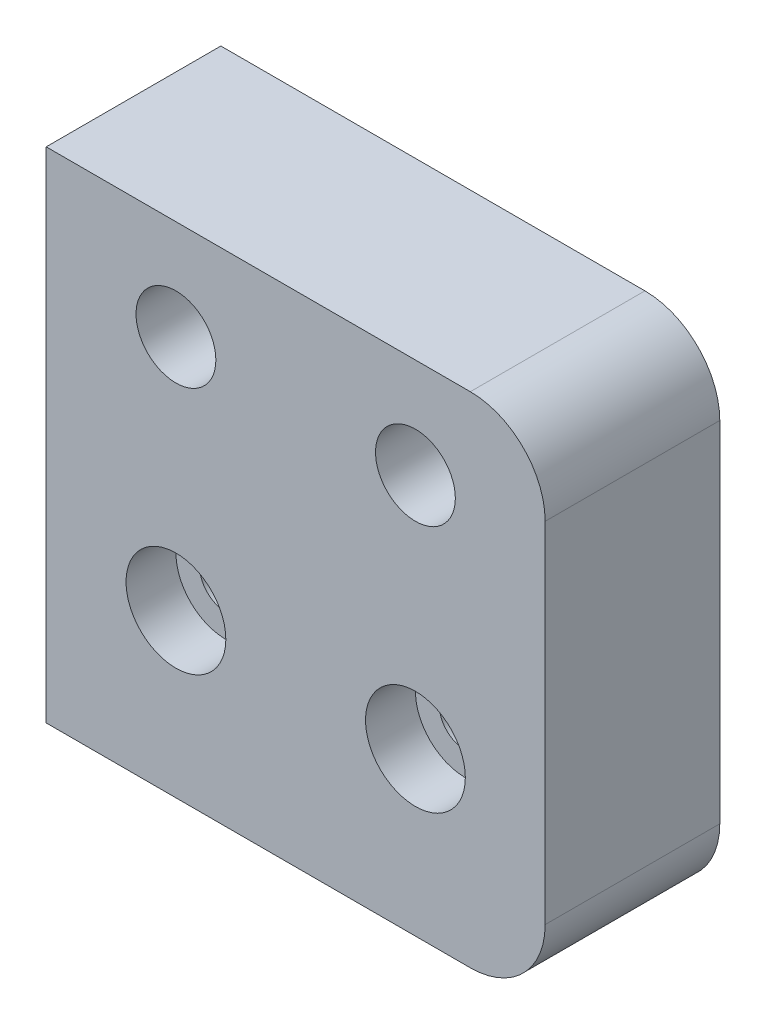
ISO-10303-21;
HEADER;
FILE_DESCRIPTION(('STEP AP214'),'2;1');
FILE_NAME('part.step','',(''),(''),'','','');
FILE_SCHEMA(('AUTOMOTIVE_DESIGN { 1 0 10303 214 1 1 1 1 }'));
ENDSEC;
DATA;
#1=APPLICATION_CONTEXT('core data for automotive mechanical design processes');
#2=APPLICATION_PROTOCOL_DEFINITION('international standard','automotive_design',2000,#1);
#3=PRODUCT_CONTEXT('',#1,'mechanical');
#4=PRODUCT('Part','Part','',(#3));
#5=PRODUCT_RELATED_PRODUCT_CATEGORY('part','',(#4));
#6=PRODUCT_DEFINITION_FORMATION('','',#4);
#7=PRODUCT_DEFINITION_CONTEXT('part definition',#1,'design');
#8=PRODUCT_DEFINITION('design','',#6,#7);
#9=PRODUCT_DEFINITION_SHAPE('','',#8);
#10=(LENGTH_UNIT() NAMED_UNIT(*) SI_UNIT(.MILLI.,.METRE.));
#11=(NAMED_UNIT(*) PLANE_ANGLE_UNIT() SI_UNIT($,.RADIAN.));
#12=(NAMED_UNIT(*) SI_UNIT($,.STERADIAN.) SOLID_ANGLE_UNIT());
#13=UNCERTAINTY_MEASURE_WITH_UNIT(LENGTH_MEASURE(1.E-05),#10,'distance_accuracy_value','');
#14=(GEOMETRIC_REPRESENTATION_CONTEXT(3) GLOBAL_UNCERTAINTY_ASSIGNED_CONTEXT((#13)) GLOBAL_UNIT_ASSIGNED_CONTEXT((#10,
#11,#12)) REPRESENTATION_CONTEXT('',''));
#15=CARTESIAN_POINT('',(0.,0.,0.));
#16=DIRECTION('',(0.,0.,1.));
#17=DIRECTION('',(1.,0.,0.));
#18=AXIS2_PLACEMENT_3D('',#15,#16,#17);
#19=CARTESIAN_POINT('',(14.8,6.5,7.));
#20=DIRECTION('',(0.,0.,-1.));
#21=DIRECTION('',(-1.,0.,0.));
#22=AXIS2_PLACEMENT_3D('',#19,#20,#21);
#23=CYLINDRICAL_SURFACE('',#22,1.05);
#24=CARTESIAN_POINT('',(14.8,6.5,0.));
#25=DIRECTION('',(0.,0.,1.));
#26=DIRECTION('',(1.,0.,0.));
#27=AXIS2_PLACEMENT_3D('',#24,#25,#26);
#28=CIRCLE('',#27,1.05);
#29=CARTESIAN_POINT('',(15.85,6.5,0.));
#30=VERTEX_POINT('',#29);
#31=EDGE_CURVE('E139',#30,#30,#28,.T.);
#32=ORIENTED_EDGE('',*,*,#31,.F.);
#33=EDGE_LOOP('',(#32));
#34=FACE_BOUND('',#33,.T.);
#35=CARTESIAN_POINT('',(14.8,6.5,5.));
#36=DIRECTION('',(0.,0.,1.));
#37=DIRECTION('',(1.,0.,0.));
#38=AXIS2_PLACEMENT_3D('',#35,#36,#37);
#39=CIRCLE('',#38,1.05);
#40=CARTESIAN_POINT('',(15.85,6.5,5.));
#41=VERTEX_POINT('',#40);
#42=EDGE_CURVE('E37',#41,#41,#39,.T.);
#43=ORIENTED_EDGE('',*,*,#42,.T.);
#44=EDGE_LOOP('',(#43));
#45=FACE_BOUND('',#44,.T.);
#46=ADVANCED_FACE('F33',(#34,#45),#23,.F.);
#47=CARTESIAN_POINT('',(5.2,6.5,7.));
#48=DIRECTION('',(0.,0.,-1.));
#49=DIRECTION('',(-1.,0.,0.));
#50=AXIS2_PLACEMENT_3D('',#47,#48,#49);
#51=CYLINDRICAL_SURFACE('',#50,1.05);
#52=CARTESIAN_POINT('',(5.2,6.5,0.));
#53=DIRECTION('',(0.,0.,1.));
#54=DIRECTION('',(1.,0.,0.));
#55=AXIS2_PLACEMENT_3D('',#52,#53,#54);
#56=CIRCLE('',#55,1.05);
#57=CARTESIAN_POINT('',(6.25,6.5,0.));
#58=VERTEX_POINT('',#57);
#59=EDGE_CURVE('E144',#58,#58,#56,.T.);
#60=ORIENTED_EDGE('',*,*,#59,.F.);
#61=EDGE_LOOP('',(#60));
#62=FACE_BOUND('',#61,.T.);
#63=CARTESIAN_POINT('',(5.2,6.5,5.));
#64=DIRECTION('',(0.,0.,1.));
#65=DIRECTION('',(1.,0.,0.));
#66=AXIS2_PLACEMENT_3D('',#63,#64,#65);
#67=CIRCLE('',#66,1.05);
#68=CARTESIAN_POINT('',(6.25,6.5,5.));
#69=VERTEX_POINT('',#68);
#70=EDGE_CURVE('E137',#69,#69,#67,.T.);
#71=ORIENTED_EDGE('',*,*,#70,.T.);
#72=EDGE_LOOP('',(#71));
#73=FACE_BOUND('',#72,.T.);
#74=ADVANCED_FACE('F196',(#62,#73),#51,.F.);
#75=CARTESIAN_POINT('',(17.,17.,7.));
#76=DIRECTION('',(0.,0.,1.));
#77=DIRECTION('',(1.,0.,0.));
#78=AXIS2_PLACEMENT_3D('',#75,#76,#77);
#79=PLANE('',#78);
#80=CARTESIAN_POINT('',(14.8,6.5,7.));
#81=DIRECTION('',(0.,0.,1.));
#82=DIRECTION('',(1.,0.,0.));
#83=AXIS2_PLACEMENT_3D('',#80,#81,#82);
#84=CIRCLE('',#83,2.);
#85=CARTESIAN_POINT('',(16.8,6.5,7.));
#86=VERTEX_POINT('',#85);
#87=EDGE_CURVE('E154',#86,#86,#84,.T.);
#88=ORIENTED_EDGE('',*,*,#87,.F.);
#89=EDGE_LOOP('',(#88));
#90=FACE_BOUND('',#89,.T.);
#91=CARTESIAN_POINT('',(5.2,6.5,7.));
#92=DIRECTION('',(0.,0.,1.));
#93=DIRECTION('',(1.,0.,0.));
#94=AXIS2_PLACEMENT_3D('',#91,#92,#93);
#95=CIRCLE('',#94,2.);
#96=CARTESIAN_POINT('',(7.2,6.5,7.));
#97=VERTEX_POINT('',#96);
#98=EDGE_CURVE('E147',#97,#97,#95,.T.);
#99=ORIENTED_EDGE('',*,*,#98,.F.);
#100=EDGE_LOOP('',(#99));
#101=FACE_BOUND('',#100,.T.);
#102=CARTESIAN_POINT('',(5.2,16.,7.));
#103=DIRECTION('',(0.,0.,1.));
#104=DIRECTION('',(1.,0.,0.));
#105=AXIS2_PLACEMENT_3D('',#102,#103,#104);
#106=CIRCLE('',#105,1.6);
#107=CARTESIAN_POINT('',(6.8,16.,7.));
#108=VERTEX_POINT('',#107);
#109=EDGE_CURVE('E125',#108,#108,#106,.T.);
#110=ORIENTED_EDGE('',*,*,#109,.F.);
#111=EDGE_LOOP('',(#110));
#112=FACE_BOUND('',#111,.T.);
#113=DIRECTION('',(0.,-1.,0.));
#114=VECTOR('',#113,1.);
#115=CARTESIAN_POINT('',(0.,0.,7.));
#116=LINE('',#115,#114);
#117=CARTESIAN_POINT('',(0.,20.,7.));
#118=VERTEX_POINT('',#117);
#119=CARTESIAN_POINT('',(0.,0.,7.));
#120=VERTEX_POINT('',#119);
#121=EDGE_CURVE('E132',#118,#120,#116,.T.);
#122=ORIENTED_EDGE('',*,*,#121,.T.);
#123=DIRECTION('',(1.,0.,0.));
#124=VECTOR('',#123,1.);
#125=CARTESIAN_POINT('',(0.,0.,7.));
#126=LINE('',#125,#124);
#127=CARTESIAN_POINT('',(17.,0.,7.));
#128=VERTEX_POINT('',#127);
#129=EDGE_CURVE('E89',#120,#128,#126,.T.);
#130=ORIENTED_EDGE('',*,*,#129,.T.);
#131=CARTESIAN_POINT('',(17.,3.,7.));
#132=DIRECTION('',(0.,0.,1.));
#133=DIRECTION('',(1.,0.,0.));
#134=AXIS2_PLACEMENT_3D('',#131,#132,#133);
#135=CIRCLE('',#134,3.);
#136=CARTESIAN_POINT('',(20.,3.00000000000002,7.));
#137=VERTEX_POINT('',#136);
#138=EDGE_CURVE('E103',#128,#137,#135,.T.);
#139=ORIENTED_EDGE('',*,*,#138,.T.);
#140=DIRECTION('',(0.,1.,0.));
#141=VECTOR('',#140,1.);
#142=CARTESIAN_POINT('',(20.,3.00000000000002,7.));
#143=LINE('',#142,#141);
#144=CARTESIAN_POINT('',(20.,17.,7.));
#145=VERTEX_POINT('',#144);
#146=EDGE_CURVE('E96',#137,#145,#143,.T.);
#147=ORIENTED_EDGE('',*,*,#146,.T.);
#148=CARTESIAN_POINT('',(17.,17.,7.));
#149=DIRECTION('',(0.,0.,1.));
#150=DIRECTION('',(1.,0.,0.));
#151=AXIS2_PLACEMENT_3D('',#148,#149,#150);
#152=CIRCLE('',#151,3.);
#153=CARTESIAN_POINT('',(17.,20.,7.));
#154=VERTEX_POINT('',#153);
#155=EDGE_CURVE('E101',#145,#154,#152,.T.);
#156=ORIENTED_EDGE('',*,*,#155,.T.);
#157=DIRECTION('',(-1.,0.,0.));
#158=VECTOR('',#157,1.);
#159=CARTESIAN_POINT('',(0.,20.,7.));
#160=LINE('',#159,#158);
#161=EDGE_CURVE('E52',#154,#118,#160,.T.);
#162=ORIENTED_EDGE('',*,*,#161,.T.);
#163=EDGE_LOOP('',(#122,#130,#139,#147,#156,#162));
#164=FACE_BOUND('',#163,.T.);
#165=CARTESIAN_POINT('',(14.8,16.,7.));
#166=DIRECTION('',(0.,0.,1.));
#167=DIRECTION('',(1.,0.,0.));
#168=AXIS2_PLACEMENT_3D('',#165,#166,#167);
#169=CIRCLE('',#168,1.6);
#170=CARTESIAN_POINT('',(16.4,16.,7.));
#171=VERTEX_POINT('',#170);
#172=EDGE_CURVE('E160',#171,#171,#169,.T.);
#173=ORIENTED_EDGE('',*,*,#172,.F.);
#174=EDGE_LOOP('',(#173));
#175=FACE_BOUND('',#174,.T.);
#176=ADVANCED_FACE('F98',(#90,#101,#112,#164,#175),#79,.T.);
#177=CARTESIAN_POINT('',(17.,17.,0.));
#178=DIRECTION('',(0.,0.,1.));
#179=DIRECTION('',(1.,0.,0.));
#180=AXIS2_PLACEMENT_3D('',#177,#178,#179);
#181=PLANE('',#180);
#182=ORIENTED_EDGE('',*,*,#59,.T.);
#183=EDGE_LOOP('',(#182));
#184=FACE_BOUND('',#183,.T.);
#185=CARTESIAN_POINT('',(5.2,16.,0.));
#186=DIRECTION('',(0.,0.,1.));
#187=DIRECTION('',(1.,0.,0.));
#188=AXIS2_PLACEMENT_3D('',#185,#186,#187);
#189=CIRCLE('',#188,1.6);
#190=CARTESIAN_POINT('',(6.8,16.,0.));
#191=VERTEX_POINT('',#190);
#192=EDGE_CURVE('E163',#191,#191,#189,.T.);
#193=ORIENTED_EDGE('',*,*,#192,.T.);
#194=EDGE_LOOP('',(#193));
#195=FACE_BOUND('',#194,.T.);
#196=DIRECTION('',(0.,-1.,0.));
#197=VECTOR('',#196,1.);
#198=CARTESIAN_POINT('',(0.,0.,0.));
#199=LINE('',#198,#197);
#200=CARTESIAN_POINT('',(0.,20.,0.));
#201=VERTEX_POINT('',#200);
#202=CARTESIAN_POINT('',(0.,0.,0.));
#203=VERTEX_POINT('',#202);
#204=EDGE_CURVE('E121',#201,#203,#199,.T.);
#205=ORIENTED_EDGE('',*,*,#204,.F.);
#206=DIRECTION('',(-1.,0.,0.));
#207=VECTOR('',#206,1.);
#208=CARTESIAN_POINT('',(0.,20.,0.));
#209=LINE('',#208,#207);
#210=CARTESIAN_POINT('',(17.,20.,0.));
#211=VERTEX_POINT('',#210);
#212=EDGE_CURVE('E81',#211,#201,#209,.T.);
#213=ORIENTED_EDGE('',*,*,#212,.F.);
#214=CARTESIAN_POINT('',(17.,17.,0.));
#215=DIRECTION('',(0.,0.,1.));
#216=DIRECTION('',(1.,0.,0.));
#217=AXIS2_PLACEMENT_3D('',#214,#215,#216);
#218=CIRCLE('',#217,3.);
#219=CARTESIAN_POINT('',(20.,17.,0.));
#220=VERTEX_POINT('',#219);
#221=EDGE_CURVE('E75',#220,#211,#218,.T.);
#222=ORIENTED_EDGE('',*,*,#221,.F.);
#223=DIRECTION('',(0.,1.,0.));
#224=VECTOR('',#223,1.);
#225=CARTESIAN_POINT('',(20.,3.00000000000002,0.));
#226=LINE('',#225,#224);
#227=CARTESIAN_POINT('',(20.,3.00000000000002,0.));
#228=VERTEX_POINT('',#227);
#229=EDGE_CURVE('E111',#228,#220,#226,.T.);
#230=ORIENTED_EDGE('',*,*,#229,.F.);
#231=CARTESIAN_POINT('',(17.,3.,0.));
#232=DIRECTION('',(0.,0.,1.));
#233=DIRECTION('',(1.,0.,0.));
#234=AXIS2_PLACEMENT_3D('',#231,#232,#233);
#235=CIRCLE('',#234,3.);
#236=CARTESIAN_POINT('',(17.,0.,0.));
#237=VERTEX_POINT('',#236);
#238=EDGE_CURVE('E127',#237,#228,#235,.T.);
#239=ORIENTED_EDGE('',*,*,#238,.F.);
#240=DIRECTION('',(1.,0.,0.));
#241=VECTOR('',#240,1.);
#242=CARTESIAN_POINT('',(0.,0.,0.));
#243=LINE('',#242,#241);
#244=EDGE_CURVE('E124',#203,#237,#243,.T.);
#245=ORIENTED_EDGE('',*,*,#244,.F.);
#246=EDGE_LOOP('',(#205,#213,#222,#230,#239,#245));
#247=FACE_BOUND('',#246,.T.);
#248=CARTESIAN_POINT('',(14.8,16.,0.));
#249=DIRECTION('',(0.,0.,1.));
#250=DIRECTION('',(1.,0.,0.));
#251=AXIS2_PLACEMENT_3D('',#248,#249,#250);
#252=CIRCLE('',#251,1.6);
#253=CARTESIAN_POINT('',(16.4,16.,0.));
#254=VERTEX_POINT('',#253);
#255=EDGE_CURVE('E159',#254,#254,#252,.T.);
#256=ORIENTED_EDGE('',*,*,#255,.T.);
#257=EDGE_LOOP('',(#256));
#258=FACE_BOUND('',#257,.T.);
#259=ORIENTED_EDGE('',*,*,#31,.T.);
#260=EDGE_LOOP('',(#259));
#261=FACE_BOUND('',#260,.T.);
#262=ADVANCED_FACE('F179',(#184,#195,#247,#258,#261),#181,.F.);
#263=CARTESIAN_POINT('',(0.,0.,7.));
#264=DIRECTION('',(1.,0.,0.));
#265=DIRECTION('',(0.,0.,-1.));
#266=AXIS2_PLACEMENT_3D('',#263,#264,#265);
#267=PLANE('',#266);
#268=ORIENTED_EDGE('',*,*,#204,.T.);
#269=DIRECTION('',(0.,0.,-1.));
#270=VECTOR('',#269,1.);
#271=CARTESIAN_POINT('',(0.,0.,7.));
#272=LINE('',#271,#270);
#273=EDGE_CURVE('E11',#120,#203,#272,.T.);
#274=ORIENTED_EDGE('',*,*,#273,.F.);
#275=ORIENTED_EDGE('',*,*,#121,.F.);
#276=DIRECTION('',(0.,0.,-1.));
#277=VECTOR('',#276,1.);
#278=CARTESIAN_POINT('',(0.,20.,7.));
#279=LINE('',#278,#277);
#280=EDGE_CURVE('E117',#118,#201,#279,.T.);
#281=ORIENTED_EDGE('',*,*,#280,.T.);
#282=EDGE_LOOP('',(#268,#274,#275,#281));
#283=FACE_BOUND('',#282,.T.);
#284=ADVANCED_FACE('F35',(#283),#267,.F.);
#285=CARTESIAN_POINT('',(0.,0.,7.));
#286=DIRECTION('',(0.,1.,0.));
#287=DIRECTION('',(0.,0.,1.));
#288=AXIS2_PLACEMENT_3D('',#285,#286,#287);
#289=PLANE('',#288);
#290=ORIENTED_EDGE('',*,*,#244,.T.);
#291=DIRECTION('',(0.,0.,-1.));
#292=VECTOR('',#291,1.);
#293=CARTESIAN_POINT('',(17.,0.,7.));
#294=LINE('',#293,#292);
#295=EDGE_CURVE('E43',#128,#237,#294,.T.);
#296=ORIENTED_EDGE('',*,*,#295,.F.);
#297=ORIENTED_EDGE('',*,*,#129,.F.);
#298=ORIENTED_EDGE('',*,*,#273,.T.);
#299=EDGE_LOOP('',(#290,#296,#297,#298));
#300=FACE_BOUND('',#299,.T.);
#301=ADVANCED_FACE('F173',(#300),#289,.F.);
#302=CARTESIAN_POINT('',(17.,3.,7.));
#303=DIRECTION('',(0.,0.,-1.));
#304=DIRECTION('',(-1.,0.,0.));
#305=AXIS2_PLACEMENT_3D('',#302,#303,#304);
#306=CYLINDRICAL_SURFACE('',#305,3.);
#307=ORIENTED_EDGE('',*,*,#238,.T.);
#308=DIRECTION('',(0.,0.,-1.));
#309=VECTOR('',#308,1.);
#310=CARTESIAN_POINT('',(20.,3.00000000000002,7.));
#311=LINE('',#310,#309);
#312=EDGE_CURVE('E112',#137,#228,#311,.T.);
#313=ORIENTED_EDGE('',*,*,#312,.F.);
#314=ORIENTED_EDGE('',*,*,#138,.F.);
#315=ORIENTED_EDGE('',*,*,#295,.T.);
#316=EDGE_LOOP('',(#307,#313,#314,#315));
#317=FACE_BOUND('',#316,.T.);
#318=ADVANCED_FACE('F176',(#317),#306,.T.);
#319=CARTESIAN_POINT('',(20.,3.00000000000002,7.));
#320=DIRECTION('',(-1.,0.,0.));
#321=DIRECTION('',(0.,0.,1.));
#322=AXIS2_PLACEMENT_3D('',#319,#320,#321);
#323=PLANE('',#322);
#324=ORIENTED_EDGE('',*,*,#229,.T.);
#325=DIRECTION('',(0.,0.,-1.));
#326=VECTOR('',#325,1.);
#327=CARTESIAN_POINT('',(20.,17.,7.));
#328=LINE('',#327,#326);
#329=EDGE_CURVE('E108',#145,#220,#328,.T.);
#330=ORIENTED_EDGE('',*,*,#329,.F.);
#331=ORIENTED_EDGE('',*,*,#146,.F.);
#332=ORIENTED_EDGE('',*,*,#312,.T.);
#333=EDGE_LOOP('',(#324,#330,#331,#332));
#334=FACE_BOUND('',#333,.T.);
#335=ADVANCED_FACE('F109',(#334),#323,.F.);
#336=CARTESIAN_POINT('',(17.,17.,7.));
#337=DIRECTION('',(0.,0.,-1.));
#338=DIRECTION('',(-1.,0.,0.));
#339=AXIS2_PLACEMENT_3D('',#336,#337,#338);
#340=CYLINDRICAL_SURFACE('',#339,3.);
#341=ORIENTED_EDGE('',*,*,#221,.T.);
#342=DIRECTION('',(0.,0.,-1.));
#343=VECTOR('',#342,1.);
#344=CARTESIAN_POINT('',(17.,20.,7.));
#345=LINE('',#344,#343);
#346=EDGE_CURVE('E113',#154,#211,#345,.T.);
#347=ORIENTED_EDGE('',*,*,#346,.F.);
#348=ORIENTED_EDGE('',*,*,#155,.F.);
#349=ORIENTED_EDGE('',*,*,#329,.T.);
#350=EDGE_LOOP('',(#341,#347,#348,#349));
#351=FACE_BOUND('',#350,.T.);
#352=ADVANCED_FACE('F115',(#351),#340,.T.);
#353=CARTESIAN_POINT('',(0.,20.,7.));
#354=DIRECTION('',(0.,-1.,0.));
#355=DIRECTION('',(0.,0.,-1.));
#356=AXIS2_PLACEMENT_3D('',#353,#354,#355);
#357=PLANE('',#356);
#358=ORIENTED_EDGE('',*,*,#212,.T.);
#359=ORIENTED_EDGE('',*,*,#280,.F.);
#360=ORIENTED_EDGE('',*,*,#161,.F.);
#361=ORIENTED_EDGE('',*,*,#346,.T.);
#362=EDGE_LOOP('',(#358,#359,#360,#361));
#363=FACE_BOUND('',#362,.T.);
#364=ADVANCED_FACE('F182',(#363),#357,.F.);
#365=CARTESIAN_POINT('',(5.2,16.,7.));
#366=DIRECTION('',(0.,0.,-1.));
#367=DIRECTION('',(-1.,0.,0.));
#368=AXIS2_PLACEMENT_3D('',#365,#366,#367);
#369=CYLINDRICAL_SURFACE('',#368,1.6);
#370=ORIENTED_EDGE('',*,*,#109,.T.);
#371=EDGE_LOOP('',(#370));
#372=FACE_BOUND('',#371,.T.);
#373=ORIENTED_EDGE('',*,*,#192,.F.);
#374=EDGE_LOOP('',(#373));
#375=FACE_BOUND('',#374,.T.);
#376=ADVANCED_FACE('F184',(#372,#375),#369,.F.);
#377=CARTESIAN_POINT('',(14.8,16.,7.));
#378=DIRECTION('',(0.,0.,-1.));
#379=DIRECTION('',(-1.,0.,0.));
#380=AXIS2_PLACEMENT_3D('',#377,#378,#379);
#381=CYLINDRICAL_SURFACE('',#380,1.6);
#382=ORIENTED_EDGE('',*,*,#172,.T.);
#383=EDGE_LOOP('',(#382));
#384=FACE_BOUND('',#383,.T.);
#385=ORIENTED_EDGE('',*,*,#255,.F.);
#386=EDGE_LOOP('',(#385));
#387=FACE_BOUND('',#386,.T.);
#388=ADVANCED_FACE('F190',(#384,#387),#381,.F.);
#389=CARTESIAN_POINT('',(5.2,6.5,5.));
#390=DIRECTION('',(0.,0.,1.));
#391=DIRECTION('',(1.,0.,0.));
#392=AXIS2_PLACEMENT_3D('',#389,#390,#391);
#393=CYLINDRICAL_SURFACE('',#392,2.);
#394=CARTESIAN_POINT('',(5.2,6.5,5.));
#395=DIRECTION('',(0.,0.,1.));
#396=DIRECTION('',(1.,0.,0.));
#397=AXIS2_PLACEMENT_3D('',#394,#395,#396);
#398=CIRCLE('',#397,2.);
#399=CARTESIAN_POINT('',(7.2,6.5,5.));
#400=VERTEX_POINT('',#399);
#401=EDGE_CURVE('E140',#400,#400,#398,.T.);
#402=ORIENTED_EDGE('',*,*,#401,.F.);
#403=EDGE_LOOP('',(#402));
#404=FACE_BOUND('',#403,.T.);
#405=ORIENTED_EDGE('',*,*,#98,.T.);
#406=EDGE_LOOP('',(#405));
#407=FACE_BOUND('',#406,.T.);
#408=ADVANCED_FACE('F207',(#404,#407),#393,.F.);
#409=CARTESIAN_POINT('',(5.2,6.5,5.));
#410=DIRECTION('',(0.,0.,1.));
#411=DIRECTION('',(1.,0.,0.));
#412=AXIS2_PLACEMENT_3D('',#409,#410,#411);
#413=PLANE('',#412);
#414=ORIENTED_EDGE('',*,*,#70,.F.);
#415=EDGE_LOOP('',(#414));
#416=FACE_BOUND('',#415,.T.);
#417=ORIENTED_EDGE('',*,*,#401,.T.);
#418=EDGE_LOOP('',(#417));
#419=FACE_BOUND('',#418,.T.);
#420=ADVANCED_FACE('F283',(#416,#419),#413,.T.);
#421=CARTESIAN_POINT('',(14.8,6.5,5.));
#422=DIRECTION('',(0.,0.,1.));
#423=DIRECTION('',(1.,0.,0.));
#424=AXIS2_PLACEMENT_3D('',#421,#422,#423);
#425=CYLINDRICAL_SURFACE('',#424,2.);
#426=CARTESIAN_POINT('',(14.8,6.5,5.));
#427=DIRECTION('',(0.,0.,1.));
#428=DIRECTION('',(1.,0.,0.));
#429=AXIS2_PLACEMENT_3D('',#426,#427,#428);
#430=CIRCLE('',#429,2.);
#431=CARTESIAN_POINT('',(16.8,6.5,5.));
#432=VERTEX_POINT('',#431);
#433=EDGE_CURVE('E320',#432,#432,#430,.T.);
#434=ORIENTED_EDGE('',*,*,#433,.F.);
#435=EDGE_LOOP('',(#434));
#436=FACE_BOUND('',#435,.T.);
#437=ORIENTED_EDGE('',*,*,#87,.T.);
#438=EDGE_LOOP('',(#437));
#439=FACE_BOUND('',#438,.T.);
#440=ADVANCED_FACE('F292',(#436,#439),#425,.F.);
#441=CARTESIAN_POINT('',(14.8,6.5,5.));
#442=DIRECTION('',(0.,0.,1.));
#443=DIRECTION('',(1.,0.,0.));
#444=AXIS2_PLACEMENT_3D('',#441,#442,#443);
#445=PLANE('',#444);
#446=ORIENTED_EDGE('',*,*,#42,.F.);
#447=EDGE_LOOP('',(#446));
#448=FACE_BOUND('',#447,.T.);
#449=ORIENTED_EDGE('',*,*,#433,.T.);
#450=EDGE_LOOP('',(#449));
#451=FACE_BOUND('',#450,.T.);
#452=ADVANCED_FACE('F301',(#448,#451),#445,.T.);
#453=CLOSED_SHELL('',(#46,#74,#176,#262,#284,#301,#318,#335,#352,#364,#376,#388,#408,#420,#440,#452));
#454=MANIFOLD_SOLID_BREP('B2',#453);
#455=ADVANCED_BREP_SHAPE_REPRESENTATION('',(#18,#454),#14);
#456=SHAPE_DEFINITION_REPRESENTATION(#9,#455);
ENDSEC;
END-ISO-10303-21;
